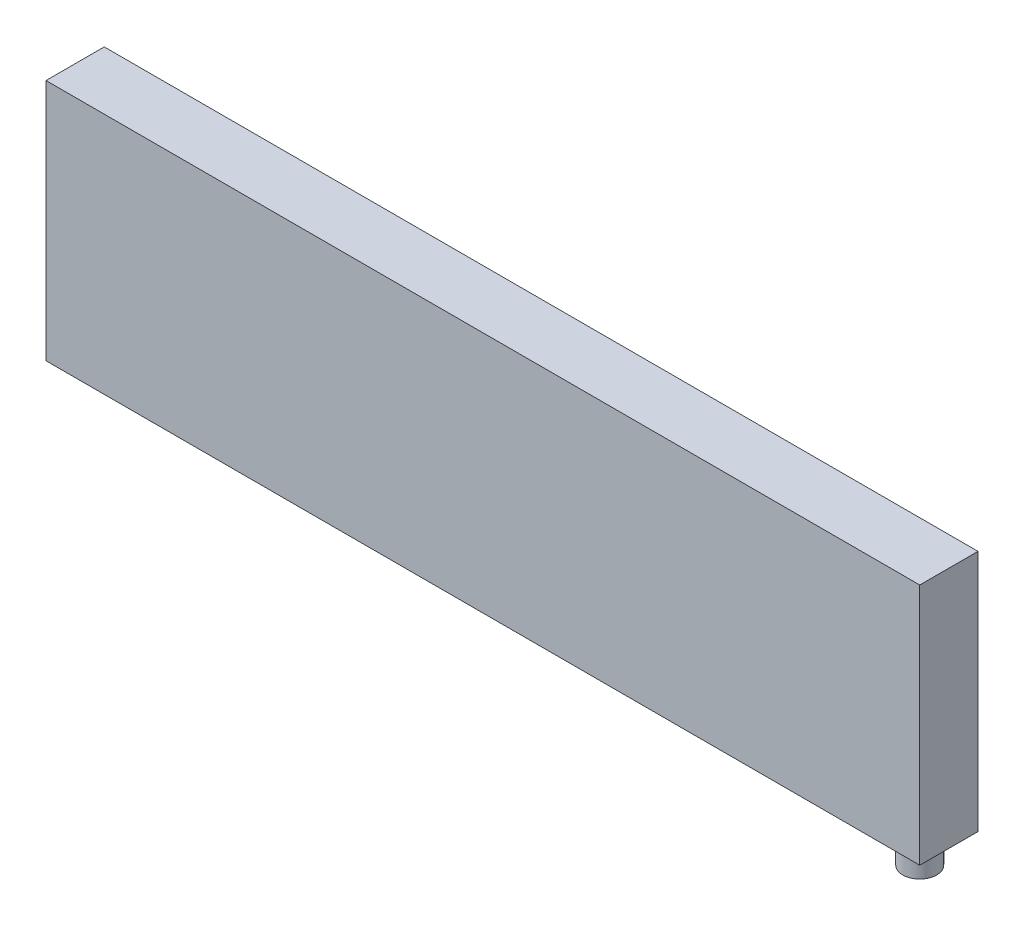
ISO-10303-21;
HEADER;
FILE_DESCRIPTION(('STEP AP214'),'2;1');
FILE_NAME('part.step','',(''),(''),'','','');
FILE_SCHEMA(('AUTOMOTIVE_DESIGN { 1 0 10303 214 1 1 1 1 }'));
ENDSEC;
DATA;
#1=APPLICATION_CONTEXT('core data for automotive mechanical design processes');
#2=APPLICATION_PROTOCOL_DEFINITION('international standard','automotive_design',2000,#1);
#3=PRODUCT_CONTEXT('',#1,'mechanical');
#4=PRODUCT('Part','Part','',(#3));
#5=PRODUCT_RELATED_PRODUCT_CATEGORY('part','',(#4));
#6=PRODUCT_DEFINITION_FORMATION('','',#4);
#7=PRODUCT_DEFINITION_CONTEXT('part definition',#1,'design');
#8=PRODUCT_DEFINITION('design','',#6,#7);
#9=PRODUCT_DEFINITION_SHAPE('','',#8);
#10=(LENGTH_UNIT() NAMED_UNIT(*) SI_UNIT(.MILLI.,.METRE.));
#11=(NAMED_UNIT(*) PLANE_ANGLE_UNIT() SI_UNIT($,.RADIAN.));
#12=(NAMED_UNIT(*) SI_UNIT($,.STERADIAN.) SOLID_ANGLE_UNIT());
#13=UNCERTAINTY_MEASURE_WITH_UNIT(LENGTH_MEASURE(1.E-05),#10,'distance_accuracy_value','');
#14=(GEOMETRIC_REPRESENTATION_CONTEXT(3) GLOBAL_UNCERTAINTY_ASSIGNED_CONTEXT((#13)) GLOBAL_UNIT_ASSIGNED_CONTEXT((#10,
#11,#12)) REPRESENTATION_CONTEXT('',''));
#15=CARTESIAN_POINT('',(0.,0.,0.));
#16=DIRECTION('',(0.,0.,1.));
#17=DIRECTION('',(1.,0.,0.));
#18=AXIS2_PLACEMENT_3D('',#15,#16,#17);
#19=CARTESIAN_POINT('',(90.,-25.,-6.));
#20=DIRECTION('',(1.,0.,0.));
#21=DIRECTION('',(0.,0.,-1.));
#22=AXIS2_PLACEMENT_3D('',#19,#20,#21);
#23=PLANE('',#22);
#24=DIRECTION('',(0.,0.,1.));
#25=VECTOR('',#24,1.);
#26=CARTESIAN_POINT('',(90.,25.,-6.));
#27=LINE('',#26,#25);
#28=CARTESIAN_POINT('',(90.,25.,-6.));
#29=VERTEX_POINT('',#28);
#30=CARTESIAN_POINT('',(90.,25.,6.));
#31=VERTEX_POINT('',#30);
#32=EDGE_CURVE('E44',#29,#31,#27,.T.);
#33=ORIENTED_EDGE('',*,*,#32,.T.);
#34=DIRECTION('',(0.,1.,0.));
#35=VECTOR('',#34,1.);
#36=CARTESIAN_POINT('',(90.,-25.,6.));
#37=LINE('',#36,#35);
#38=CARTESIAN_POINT('',(90.,-25.,6.));
#39=VERTEX_POINT('',#38);
#40=EDGE_CURVE('E82',#39,#31,#37,.T.);
#41=ORIENTED_EDGE('',*,*,#40,.F.);
#42=DIRECTION('',(0.,0.,1.));
#43=VECTOR('',#42,1.);
#44=CARTESIAN_POINT('',(90.,-25.,-6.));
#45=LINE('',#44,#43);
#46=CARTESIAN_POINT('',(90.,-25.,-6.));
#47=VERTEX_POINT('',#46);
#48=EDGE_CURVE('E11',#47,#39,#45,.T.);
#49=ORIENTED_EDGE('',*,*,#48,.F.);
#50=DIRECTION('',(0.,1.,0.));
#51=VECTOR('',#50,1.);
#52=CARTESIAN_POINT('',(90.,-25.,-6.));
#53=LINE('',#52,#51);
#54=EDGE_CURVE('E83',#47,#29,#53,.T.);
#55=ORIENTED_EDGE('',*,*,#54,.T.);
#56=EDGE_LOOP('',(#33,#41,#49,#55));
#57=FACE_BOUND('',#56,.T.);
#58=ADVANCED_FACE('F41',(#57),#23,.T.);
#59=CARTESIAN_POINT('',(-90.,-25.,-6.));
#60=DIRECTION('',(0.,-1.,0.));
#61=DIRECTION('',(0.,0.,-1.));
#62=AXIS2_PLACEMENT_3D('',#59,#60,#61);
#63=PLANE('',#62);
#64=CARTESIAN_POINT('',(84.,-25.,0.));
#65=DIRECTION('',(0.,-1.,0.));
#66=DIRECTION('',(0.,0.,-1.));
#67=AXIS2_PLACEMENT_3D('',#64,#65,#66);
#68=CIRCLE('',#67,3.50000000000001);
#69=CARTESIAN_POINT('',(84.,-25.,-3.50000000000001));
#70=VERTEX_POINT('',#69);
#71=EDGE_CURVE('E107',#70,#70,#68,.T.);
#72=ORIENTED_EDGE('',*,*,#71,.F.);
#73=EDGE_LOOP('',(#72));
#74=FACE_BOUND('',#73,.T.);
#75=ORIENTED_EDGE('',*,*,#48,.T.);
#76=DIRECTION('',(1.,0.,0.));
#77=VECTOR('',#76,1.);
#78=CARTESIAN_POINT('',(-90.,-25.,6.));
#79=LINE('',#78,#77);
#80=CARTESIAN_POINT('',(-90.,-25.,6.));
#81=VERTEX_POINT('',#80);
#82=EDGE_CURVE('E101',#81,#39,#79,.T.);
#83=ORIENTED_EDGE('',*,*,#82,.F.);
#84=DIRECTION('',(0.,0.,1.));
#85=VECTOR('',#84,1.);
#86=CARTESIAN_POINT('',(-90.,-25.,-6.));
#87=LINE('',#86,#85);
#88=CARTESIAN_POINT('',(-90.,-25.,-6.));
#89=VERTEX_POINT('',#88);
#90=EDGE_CURVE('E50',#89,#81,#87,.T.);
#91=ORIENTED_EDGE('',*,*,#90,.F.);
#92=DIRECTION('',(1.,0.,0.));
#93=VECTOR('',#92,1.);
#94=CARTESIAN_POINT('',(-90.,-25.,-6.));
#95=LINE('',#94,#93);
#96=EDGE_CURVE('E89',#89,#47,#95,.T.);
#97=ORIENTED_EDGE('',*,*,#96,.T.);
#98=EDGE_LOOP('',(#75,#83,#91,#97));
#99=FACE_BOUND('',#98,.T.);
#100=ADVANCED_FACE('F131',(#74,#99),#63,.T.);
#101=CARTESIAN_POINT('',(-90.,-25.,-6.));
#102=DIRECTION('',(-1.,0.,0.));
#103=DIRECTION('',(0.,0.,1.));
#104=AXIS2_PLACEMENT_3D('',#101,#102,#103);
#105=PLANE('',#104);
#106=ORIENTED_EDGE('',*,*,#90,.T.);
#107=DIRECTION('',(0.,-1.,0.));
#108=VECTOR('',#107,1.);
#109=CARTESIAN_POINT('',(-90.,-25.,6.));
#110=LINE('',#109,#108);
#111=CARTESIAN_POINT('',(-90.,25.,6.));
#112=VERTEX_POINT('',#111);
#113=EDGE_CURVE('E97',#112,#81,#110,.T.);
#114=ORIENTED_EDGE('',*,*,#113,.F.);
#115=DIRECTION('',(0.,0.,1.));
#116=VECTOR('',#115,1.);
#117=CARTESIAN_POINT('',(-90.,25.,-6.));
#118=LINE('',#117,#116);
#119=CARTESIAN_POINT('',(-90.,25.,-6.));
#120=VERTEX_POINT('',#119);
#121=EDGE_CURVE('E88',#120,#112,#118,.T.);
#122=ORIENTED_EDGE('',*,*,#121,.F.);
#123=DIRECTION('',(0.,-1.,0.));
#124=VECTOR('',#123,1.);
#125=CARTESIAN_POINT('',(-90.,-25.,-6.));
#126=LINE('',#125,#124);
#127=EDGE_CURVE('E120',#120,#89,#126,.T.);
#128=ORIENTED_EDGE('',*,*,#127,.T.);
#129=EDGE_LOOP('',(#106,#114,#122,#128));
#130=FACE_BOUND('',#129,.T.);
#131=ADVANCED_FACE('F128',(#130),#105,.T.);
#132=CARTESIAN_POINT('',(-90.,25.,-6.));
#133=DIRECTION('',(0.,1.,0.));
#134=DIRECTION('',(0.,0.,1.));
#135=AXIS2_PLACEMENT_3D('',#132,#133,#134);
#136=PLANE('',#135);
#137=ORIENTED_EDGE('',*,*,#121,.T.);
#138=DIRECTION('',(-1.,0.,0.));
#139=VECTOR('',#138,1.);
#140=CARTESIAN_POINT('',(-90.,25.,6.));
#141=LINE('',#140,#139);
#142=EDGE_CURVE('E91',#31,#112,#141,.T.);
#143=ORIENTED_EDGE('',*,*,#142,.F.);
#144=ORIENTED_EDGE('',*,*,#32,.F.);
#145=DIRECTION('',(-1.,0.,0.));
#146=VECTOR('',#145,1.);
#147=CARTESIAN_POINT('',(-90.,25.,-6.));
#148=LINE('',#147,#146);
#149=EDGE_CURVE('E117',#29,#120,#148,.T.);
#150=ORIENTED_EDGE('',*,*,#149,.T.);
#151=EDGE_LOOP('',(#137,#143,#144,#150));
#152=FACE_BOUND('',#151,.T.);
#153=ADVANCED_FACE('F92',(#152),#136,.T.);
#154=CARTESIAN_POINT('',(0.,0.,-6.));
#155=DIRECTION('',(0.,0.,-1.));
#156=DIRECTION('',(-1.,0.,0.));
#157=AXIS2_PLACEMENT_3D('',#154,#155,#156);
#158=PLANE('',#157);
#159=ORIENTED_EDGE('',*,*,#54,.F.);
#160=ORIENTED_EDGE('',*,*,#96,.F.);
#161=ORIENTED_EDGE('',*,*,#127,.F.);
#162=ORIENTED_EDGE('',*,*,#149,.F.);
#163=EDGE_LOOP('',(#159,#160,#161,#162));
#164=FACE_BOUND('',#163,.T.);
#165=ADVANCED_FACE('F133',(#164),#158,.T.);
#166=CARTESIAN_POINT('',(0.,0.,6.));
#167=DIRECTION('',(0.,0.,-1.));
#168=DIRECTION('',(-1.,0.,0.));
#169=AXIS2_PLACEMENT_3D('',#166,#167,#168);
#170=PLANE('',#169);
#171=ORIENTED_EDGE('',*,*,#40,.T.);
#172=ORIENTED_EDGE('',*,*,#142,.T.);
#173=ORIENTED_EDGE('',*,*,#113,.T.);
#174=ORIENTED_EDGE('',*,*,#82,.T.);
#175=EDGE_LOOP('',(#171,#172,#173,#174));
#176=FACE_BOUND('',#175,.T.);
#177=ADVANCED_FACE('F100',(#176),#170,.F.);
#178=CARTESIAN_POINT('',(84.,-31.,0.));
#179=DIRECTION('',(0.,1.,0.));
#180=DIRECTION('',(0.,0.,1.));
#181=AXIS2_PLACEMENT_3D('',#178,#179,#180);
#182=CYLINDRICAL_SURFACE('',#181,3.50000000000001);
#183=CARTESIAN_POINT('',(84.,-31.,0.));
#184=DIRECTION('',(0.,-1.,0.));
#185=DIRECTION('',(0.,0.,-1.));
#186=AXIS2_PLACEMENT_3D('',#183,#184,#185);
#187=CIRCLE('',#186,3.50000000000001);
#188=CARTESIAN_POINT('',(84.,-31.,-3.50000000000001));
#189=VERTEX_POINT('',#188);
#190=EDGE_CURVE('E103',#189,#189,#187,.T.);
#191=ORIENTED_EDGE('',*,*,#190,.F.);
#192=EDGE_LOOP('',(#191));
#193=FACE_BOUND('',#192,.T.);
#194=ORIENTED_EDGE('',*,*,#71,.T.);
#195=EDGE_LOOP('',(#194));
#196=FACE_BOUND('',#195,.T.);
#197=ADVANCED_FACE('F140',(#193,#196),#182,.T.);
#198=CARTESIAN_POINT('',(84.,-31.,0.));
#199=DIRECTION('',(0.,-1.,0.));
#200=DIRECTION('',(0.,0.,-1.));
#201=AXIS2_PLACEMENT_3D('',#198,#199,#200);
#202=PLANE('',#201);
#203=ORIENTED_EDGE('',*,*,#190,.T.);
#204=EDGE_LOOP('',(#203));
#205=FACE_BOUND('',#204,.T.);
#206=ADVANCED_FACE('F157',(#205),#202,.T.);
#207=CLOSED_SHELL('',(#58,#100,#131,#153,#165,#177,#197,#206));
#208=MANIFOLD_SOLID_BREP('B2',#207);
#209=ADVANCED_BREP_SHAPE_REPRESENTATION('',(#18,#208),#14);
#210=SHAPE_DEFINITION_REPRESENTATION(#9,#209);
ENDSEC;
END-ISO-10303-21;
